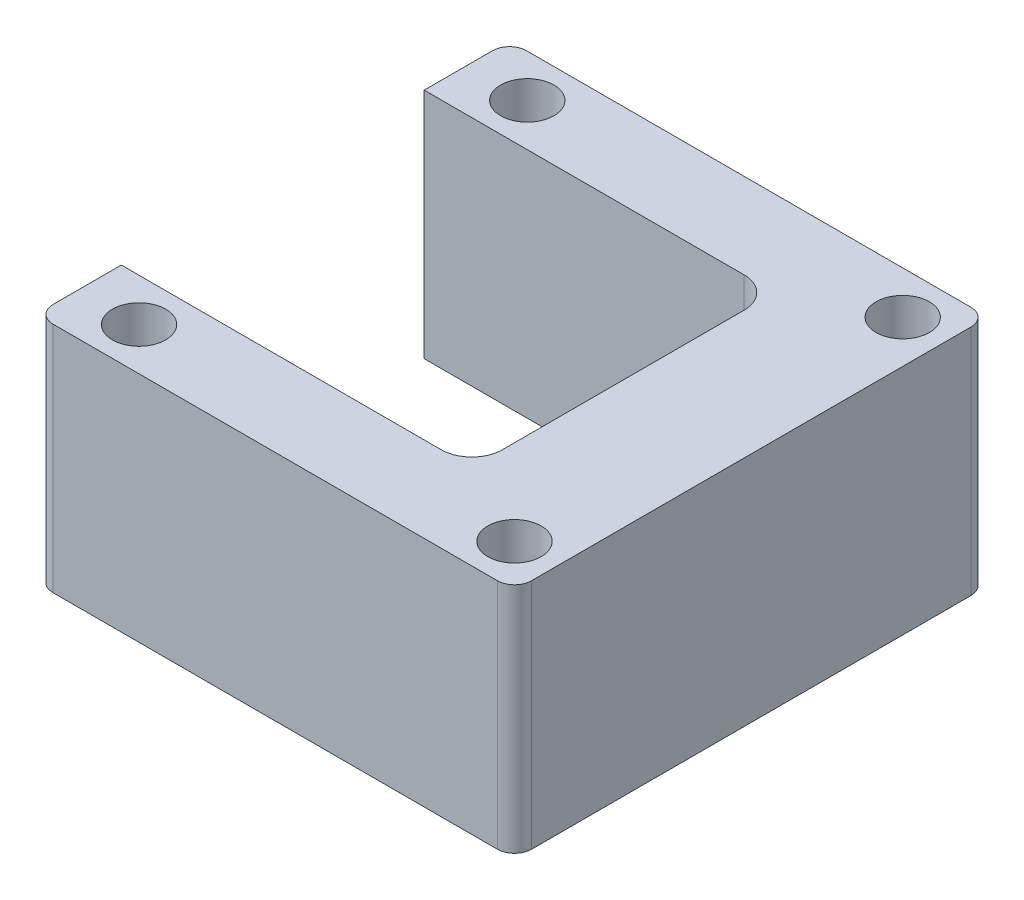
ISO-10303-21;
HEADER;
FILE_DESCRIPTION(('STEP AP214'),'2;1');
FILE_NAME('part.step','',(''),(''),'','','');
FILE_SCHEMA(('AUTOMOTIVE_DESIGN { 1 0 10303 214 1 1 1 1 }'));
ENDSEC;
DATA;
#1=APPLICATION_CONTEXT('core data for automotive mechanical design processes');
#2=APPLICATION_PROTOCOL_DEFINITION('international standard','automotive_design',2000,#1);
#3=PRODUCT_CONTEXT('',#1,'mechanical');
#4=PRODUCT('Part','Part','',(#3));
#5=PRODUCT_RELATED_PRODUCT_CATEGORY('part','',(#4));
#6=PRODUCT_DEFINITION_FORMATION('','',#4);
#7=PRODUCT_DEFINITION_CONTEXT('part definition',#1,'design');
#8=PRODUCT_DEFINITION('design','',#6,#7);
#9=PRODUCT_DEFINITION_SHAPE('','',#8);
#10=(LENGTH_UNIT() NAMED_UNIT(*) SI_UNIT(.MILLI.,.METRE.));
#11=(NAMED_UNIT(*) PLANE_ANGLE_UNIT() SI_UNIT($,.RADIAN.));
#12=(NAMED_UNIT(*) SI_UNIT($,.STERADIAN.) SOLID_ANGLE_UNIT());
#13=UNCERTAINTY_MEASURE_WITH_UNIT(LENGTH_MEASURE(1.E-05),#10,'distance_accuracy_value','');
#14=(GEOMETRIC_REPRESENTATION_CONTEXT(3) GLOBAL_UNCERTAINTY_ASSIGNED_CONTEXT((#13)) GLOBAL_UNIT_ASSIGNED_CONTEXT((#10,
#11,#12)) REPRESENTATION_CONTEXT('',''));
#15=CARTESIAN_POINT('',(0.,0.,0.));
#16=DIRECTION('',(0.,0.,1.));
#17=DIRECTION('',(1.,0.,0.));
#18=AXIS2_PLACEMENT_3D('',#15,#16,#17);
#19=CARTESIAN_POINT('',(0.,34.6202,-35.2425));
#20=DIRECTION('',(0.,0.,-1.));
#21=DIRECTION('',(-1.,0.,0.));
#22=AXIS2_PLACEMENT_3D('',#19,#20,#21);
#23=PLANE('',#22);
#24=DIRECTION('',(1.,0.,0.));
#25=VECTOR('',#24,1.);
#26=CARTESIAN_POINT('',(0.,0.,-35.2425));
#27=LINE('',#26,#25);
#28=CARTESIAN_POINT('',(-23.54707,0.,-35.2425));
#29=VERTEX_POINT('',#28);
#30=CARTESIAN_POINT('',(42.59707,0.,-35.2425));
#31=VERTEX_POINT('',#30);
#32=EDGE_CURVE('E182',#29,#31,#27,.T.);
#33=ORIENTED_EDGE('',*,*,#32,.F.);
#34=DIRECTION('',(0.,-1.,0.));
#35=VECTOR('',#34,1.);
#36=CARTESIAN_POINT('',(-23.54707,34.6202,-35.2425));
#37=LINE('',#36,#35);
#38=CARTESIAN_POINT('',(-23.54707,34.6202,-35.2425));
#39=VERTEX_POINT('',#38);
#40=EDGE_CURVE('E245',#29,#39,#37,.F.);
#41=ORIENTED_EDGE('',*,*,#40,.T.);
#42=DIRECTION('',(1.,0.,0.));
#43=VECTOR('',#42,1.);
#44=CARTESIAN_POINT('',(0.,34.6202,-35.2425));
#45=LINE('',#44,#43);
#46=CARTESIAN_POINT('',(42.59707,34.6202,-35.2425));
#47=VERTEX_POINT('',#46);
#48=EDGE_CURVE('E151',#39,#47,#45,.T.);
#49=ORIENTED_EDGE('',*,*,#48,.T.);
#50=DIRECTION('',(0.,-1.,0.));
#51=VECTOR('',#50,1.);
#52=CARTESIAN_POINT('',(42.59707,34.6202,-35.2425));
#53=LINE('',#52,#51);
#54=EDGE_CURVE('E242',#47,#31,#53,.T.);
#55=ORIENTED_EDGE('',*,*,#54,.T.);
#56=EDGE_LOOP('',(#33,#41,#49,#55));
#57=FACE_BOUND('',#56,.T.);
#58=ADVANCED_FACE('F38',(#57),#23,.T.);
#59=CARTESIAN_POINT('',(-26.08707,34.6202,0.));
#60=DIRECTION('',(1.,0.,0.));
#61=DIRECTION('',(0.,0.,-1.));
#62=AXIS2_PLACEMENT_3D('',#59,#60,#61);
#63=PLANE('',#62);
#64=DIRECTION('',(0.,0.,1.));
#65=VECTOR('',#64,1.);
#66=CARTESIAN_POINT('',(-26.08707,34.6202,0.));
#67=LINE('',#66,#65);
#68=CARTESIAN_POINT('',(-26.08707,34.6202,-32.7025));
#69=VERTEX_POINT('',#68);
#70=CARTESIAN_POINT('',(-26.08707,34.6202,-22.5425));
#71=VERTEX_POINT('',#70);
#72=EDGE_CURVE('E138',#69,#71,#67,.T.);
#73=ORIENTED_EDGE('',*,*,#72,.F.);
#74=DIRECTION('',(0.,-1.,0.));
#75=VECTOR('',#74,1.);
#76=CARTESIAN_POINT('',(-26.08707,0.,-32.7025));
#77=LINE('',#76,#75);
#78=CARTESIAN_POINT('',(-26.08707,0.,-32.7025));
#79=VERTEX_POINT('',#78);
#80=EDGE_CURVE('E240',#69,#79,#77,.T.);
#81=ORIENTED_EDGE('',*,*,#80,.T.);
#82=DIRECTION('',(0.,0.,1.));
#83=VECTOR('',#82,1.);
#84=CARTESIAN_POINT('',(-26.08707,0.,0.));
#85=LINE('',#84,#83);
#86=CARTESIAN_POINT('',(-26.08707,0.,-22.5425));
#87=VERTEX_POINT('',#86);
#88=EDGE_CURVE('E158',#79,#87,#85,.T.);
#89=ORIENTED_EDGE('',*,*,#88,.T.);
#90=DIRECTION('',(0.,-1.,0.));
#91=VECTOR('',#90,1.);
#92=CARTESIAN_POINT('',(-26.08707,34.6202,-22.5425));
#93=LINE('',#92,#91);
#94=EDGE_CURVE('E155',#71,#87,#93,.T.);
#95=ORIENTED_EDGE('',*,*,#94,.F.);
#96=EDGE_LOOP('',(#73,#81,#89,#95));
#97=FACE_BOUND('',#96,.T.);
#98=ADVANCED_FACE('F156',(#97),#63,.F.);
#99=CARTESIAN_POINT('',(0.,34.6202,-22.5425));
#100=DIRECTION('',(0.,0.,-1.));
#101=DIRECTION('',(-1.,0.,0.));
#102=AXIS2_PLACEMENT_3D('',#99,#100,#101);
#103=PLANE('',#102);
#104=DIRECTION('',(1.,0.,0.));
#105=VECTOR('',#104,1.);
#106=CARTESIAN_POINT('',(0.,0.,-22.5425));
#107=LINE('',#106,#105);
#108=CARTESIAN_POINT('',(21.53539,0.,-22.5425));
#109=VERTEX_POINT('',#108);
#110=EDGE_CURVE('E187',#87,#109,#107,.T.);
#111=ORIENTED_EDGE('',*,*,#110,.T.);
#112=DIRECTION('',(0.,-1.,0.));
#113=VECTOR('',#112,1.);
#114=CARTESIAN_POINT('',(21.53539,34.6202,-22.5425));
#115=LINE('',#114,#113);
#116=CARTESIAN_POINT('',(21.53539,34.6202,-22.5425));
#117=VERTEX_POINT('',#116);
#118=EDGE_CURVE('E167',#109,#117,#115,.F.);
#119=ORIENTED_EDGE('',*,*,#118,.T.);
#120=DIRECTION('',(1.,0.,0.));
#121=VECTOR('',#120,1.);
#122=CARTESIAN_POINT('',(0.,34.6202,-22.5425));
#123=LINE('',#122,#121);
#124=EDGE_CURVE('E143',#71,#117,#123,.T.);
#125=ORIENTED_EDGE('',*,*,#124,.F.);
#126=ORIENTED_EDGE('',*,*,#94,.T.);
#127=EDGE_LOOP('',(#111,#119,#125,#126));
#128=FACE_BOUND('',#127,.T.);
#129=ADVANCED_FACE('F165',(#128),#103,.F.);
#130=CARTESIAN_POINT('',(26.08707,34.6202,0.));
#131=DIRECTION('',(-1.,0.,0.));
#132=DIRECTION('',(0.,0.,1.));
#133=AXIS2_PLACEMENT_3D('',#130,#131,#132);
#134=PLANE('',#133);
#135=DIRECTION('',(0.,0.,-1.));
#136=VECTOR('',#135,1.);
#137=CARTESIAN_POINT('',(26.08707,0.,0.));
#138=LINE('',#137,#136);
#139=CARTESIAN_POINT('',(26.08707,0.,17.99082));
#140=VERTEX_POINT('',#139);
#141=CARTESIAN_POINT('',(26.08707,0.,-17.99082));
#142=VERTEX_POINT('',#141);
#143=EDGE_CURVE('E190',#140,#142,#138,.T.);
#144=ORIENTED_EDGE('',*,*,#143,.F.);
#145=DIRECTION('',(0.,-1.,0.));
#146=VECTOR('',#145,1.);
#147=CARTESIAN_POINT('',(26.08707,34.6202,17.99082));
#148=LINE('',#147,#146);
#149=CARTESIAN_POINT('',(26.08707,34.6202,17.99082));
#150=VERTEX_POINT('',#149);
#151=EDGE_CURVE('E208',#140,#150,#148,.F.);
#152=ORIENTED_EDGE('',*,*,#151,.T.);
#153=DIRECTION('',(0.,0.,-1.));
#154=VECTOR('',#153,1.);
#155=CARTESIAN_POINT('',(26.08707,34.6202,0.));
#156=LINE('',#155,#154);
#157=CARTESIAN_POINT('',(26.08707,34.6202,-17.99082));
#158=VERTEX_POINT('',#157);
#159=EDGE_CURVE('E168',#150,#158,#156,.T.);
#160=ORIENTED_EDGE('',*,*,#159,.T.);
#161=DIRECTION('',(0.,-1.,0.));
#162=VECTOR('',#161,1.);
#163=CARTESIAN_POINT('',(26.08707,34.6202,-17.99082));
#164=LINE('',#163,#162);
#165=EDGE_CURVE('E205',#158,#142,#164,.T.);
#166=ORIENTED_EDGE('',*,*,#165,.T.);
#167=EDGE_LOOP('',(#144,#152,#160,#166));
#168=FACE_BOUND('',#167,.T.);
#169=ADVANCED_FACE('F387',(#168),#134,.T.);
#170=CARTESIAN_POINT('',(0.,34.6202,22.5425));
#171=DIRECTION('',(0.,0.,-1.));
#172=DIRECTION('',(-1.,0.,0.));
#173=AXIS2_PLACEMENT_3D('',#170,#171,#172);
#174=PLANE('',#173);
#175=DIRECTION('',(1.,0.,0.));
#176=VECTOR('',#175,1.);
#177=CARTESIAN_POINT('',(0.,34.6202,22.5425));
#178=LINE('',#177,#176);
#179=CARTESIAN_POINT('',(-26.08707,34.6202,22.5425));
#180=VERTEX_POINT('',#179);
#181=CARTESIAN_POINT('',(21.53539,34.6202,22.5425));
#182=VERTEX_POINT('',#181);
#183=EDGE_CURVE('E171',#180,#182,#178,.T.);
#184=ORIENTED_EDGE('',*,*,#183,.T.);
#185=DIRECTION('',(0.,-1.,0.));
#186=VECTOR('',#185,1.);
#187=CARTESIAN_POINT('',(21.53539,0.,22.5425));
#188=LINE('',#187,#186);
#189=CARTESIAN_POINT('',(21.53539,0.,22.5425));
#190=VERTEX_POINT('',#189);
#191=EDGE_CURVE('E162',#182,#190,#188,.T.);
#192=ORIENTED_EDGE('',*,*,#191,.T.);
#193=DIRECTION('',(1.,0.,0.));
#194=VECTOR('',#193,1.);
#195=CARTESIAN_POINT('',(0.,0.,22.5425));
#196=LINE('',#195,#194);
#197=CARTESIAN_POINT('',(-26.08707,0.,22.5425));
#198=VERTEX_POINT('',#197);
#199=EDGE_CURVE('E193',#198,#190,#196,.T.);
#200=ORIENTED_EDGE('',*,*,#199,.F.);
#201=DIRECTION('',(0.,-1.,0.));
#202=VECTOR('',#201,1.);
#203=CARTESIAN_POINT('',(-26.08707,34.6202,22.5425));
#204=LINE('',#203,#202);
#205=EDGE_CURVE('E163',#180,#198,#204,.T.);
#206=ORIENTED_EDGE('',*,*,#205,.F.);
#207=EDGE_LOOP('',(#184,#192,#200,#206));
#208=FACE_BOUND('',#207,.T.);
#209=ADVANCED_FACE('F382',(#208),#174,.T.);
#210=CARTESIAN_POINT('',(-26.08707,0.,32.7025));
#211=VERTEX_POINT('',#210);
#212=EDGE_CURVE('E188',#198,#211,#85,.T.);
#213=ORIENTED_EDGE('',*,*,#212,.T.);
#214=DIRECTION('',(0.,-1.,0.));
#215=VECTOR('',#214,1.);
#216=CARTESIAN_POINT('',(-26.08707,34.6202,32.7025));
#217=LINE('',#216,#215);
#218=CARTESIAN_POINT('',(-26.08707,34.6202,32.7025));
#219=VERTEX_POINT('',#218);
#220=EDGE_CURVE('E232',#211,#219,#217,.F.);
#221=ORIENTED_EDGE('',*,*,#220,.T.);
#222=EDGE_CURVE('E153',#180,#219,#67,.T.);
#223=ORIENTED_EDGE('',*,*,#222,.F.);
#224=ORIENTED_EDGE('',*,*,#205,.T.);
#225=EDGE_LOOP('',(#213,#221,#223,#224));
#226=FACE_BOUND('',#225,.T.);
#227=ADVANCED_FACE('F344',(#226),#63,.F.);
#228=CARTESIAN_POINT('',(0.,34.6202,35.2425));
#229=DIRECTION('',(0.,0.,1.));
#230=DIRECTION('',(1.,0.,0.));
#231=AXIS2_PLACEMENT_3D('',#228,#229,#230);
#232=PLANE('',#231);
#233=DIRECTION('',(-1.,0.,0.));
#234=VECTOR('',#233,1.);
#235=CARTESIAN_POINT('',(0.,34.6202,35.2425));
#236=LINE('',#235,#234);
#237=CARTESIAN_POINT('',(42.59707,34.6202,35.2425));
#238=VERTEX_POINT('',#237);
#239=CARTESIAN_POINT('',(-23.54707,34.6202,35.2425));
#240=VERTEX_POINT('',#239);
#241=EDGE_CURVE('E177',#238,#240,#236,.T.);
#242=ORIENTED_EDGE('',*,*,#241,.T.);
#243=DIRECTION('',(0.,-1.,0.));
#244=VECTOR('',#243,1.);
#245=CARTESIAN_POINT('',(-23.54707,0.,35.2425));
#246=LINE('',#245,#244);
#247=CARTESIAN_POINT('',(-23.54707,0.,35.2425));
#248=VERTEX_POINT('',#247);
#249=EDGE_CURVE('E221',#240,#248,#246,.T.);
#250=ORIENTED_EDGE('',*,*,#249,.T.);
#251=DIRECTION('',(-1.,0.,0.));
#252=VECTOR('',#251,1.);
#253=CARTESIAN_POINT('',(0.,0.,35.2425));
#254=LINE('',#253,#252);
#255=CARTESIAN_POINT('',(42.59707,0.,35.2425));
#256=VERTEX_POINT('',#255);
#257=EDGE_CURVE('E196',#256,#248,#254,.T.);
#258=ORIENTED_EDGE('',*,*,#257,.F.);
#259=DIRECTION('',(0.,-1.,0.));
#260=VECTOR('',#259,1.);
#261=CARTESIAN_POINT('',(42.59707,34.6202,35.2425));
#262=LINE('',#261,#260);
#263=EDGE_CURVE('E219',#256,#238,#262,.F.);
#264=ORIENTED_EDGE('',*,*,#263,.T.);
#265=EDGE_LOOP('',(#242,#250,#258,#264));
#266=FACE_BOUND('',#265,.T.);
#267=ADVANCED_FACE('F371',(#266),#232,.T.);
#268=CARTESIAN_POINT('',(45.13707,34.6202,0.));
#269=DIRECTION('',(1.,0.,0.));
#270=DIRECTION('',(0.,0.,-1.));
#271=AXIS2_PLACEMENT_3D('',#268,#269,#270);
#272=PLANE('',#271);
#273=DIRECTION('',(0.,0.,1.));
#274=VECTOR('',#273,1.);
#275=CARTESIAN_POINT('',(45.13707,0.,0.));
#276=LINE('',#275,#274);
#277=CARTESIAN_POINT('',(45.13707,0.,-32.7025));
#278=VERTEX_POINT('',#277);
#279=CARTESIAN_POINT('',(45.13707,0.,32.7025));
#280=VERTEX_POINT('',#279);
#281=EDGE_CURVE('E199',#278,#280,#276,.T.);
#282=ORIENTED_EDGE('',*,*,#281,.F.);
#283=DIRECTION('',(0.,-1.,0.));
#284=VECTOR('',#283,1.);
#285=CARTESIAN_POINT('',(45.13707,34.6202,-32.7025));
#286=LINE('',#285,#284);
#287=CARTESIAN_POINT('',(45.13707,34.6202,-32.7025));
#288=VERTEX_POINT('',#287);
#289=EDGE_CURVE('E11',#278,#288,#286,.F.);
#290=ORIENTED_EDGE('',*,*,#289,.T.);
#291=DIRECTION('',(0.,0.,1.));
#292=VECTOR('',#291,1.);
#293=CARTESIAN_POINT('',(45.13707,34.6202,0.));
#294=LINE('',#293,#292);
#295=CARTESIAN_POINT('',(45.13707,34.6202,32.7025));
#296=VERTEX_POINT('',#295);
#297=EDGE_CURVE('E180',#288,#296,#294,.T.);
#298=ORIENTED_EDGE('',*,*,#297,.T.);
#299=DIRECTION('',(0.,-1.,0.));
#300=VECTOR('',#299,1.);
#301=CARTESIAN_POINT('',(45.13707,34.6202,32.7025));
#302=LINE('',#301,#300);
#303=EDGE_CURVE('E46',#296,#280,#302,.T.);
#304=ORIENTED_EDGE('',*,*,#303,.T.);
#305=EDGE_LOOP('',(#282,#290,#298,#304));
#306=FACE_BOUND('',#305,.T.);
#307=ADVANCED_FACE('F248',(#306),#272,.T.);
#308=CARTESIAN_POINT('',(0.,34.6202,0.));
#309=DIRECTION('',(0.,1.,0.));
#310=DIRECTION('',(0.,0.,1.));
#311=AXIS2_PLACEMENT_3D('',#308,#309,#310);
#312=PLANE('',#311);
#313=CARTESIAN_POINT('',(38.78707,34.6202,-28.8925));
#314=DIRECTION('',(0.,1.,0.));
#315=DIRECTION('',(0.,0.,1.));
#316=AXIS2_PLACEMENT_3D('',#313,#314,#315);
#317=CIRCLE('',#316,3.96874999999999);
#318=CARTESIAN_POINT('',(38.78707,34.6202,-24.92375));
#319=VERTEX_POINT('',#318);
#320=EDGE_CURVE('E306',#319,#319,#317,.T.);
#321=ORIENTED_EDGE('',*,*,#320,.F.);
#322=EDGE_LOOP('',(#321));
#323=FACE_BOUND('',#322,.T.);
#324=CARTESIAN_POINT('',(38.78707,34.6202,28.8925));
#325=DIRECTION('',(0.,1.,0.));
#326=DIRECTION('',(0.,0.,1.));
#327=AXIS2_PLACEMENT_3D('',#324,#325,#326);
#328=CIRCLE('',#327,3.96874999999999);
#329=CARTESIAN_POINT('',(38.78707,34.6202,32.86125));
#330=VERTEX_POINT('',#329);
#331=EDGE_CURVE('E294',#330,#330,#328,.T.);
#332=ORIENTED_EDGE('',*,*,#331,.F.);
#333=EDGE_LOOP('',(#332));
#334=FACE_BOUND('',#333,.T.);
#335=CARTESIAN_POINT('',(-17.09293,34.6202,-28.8925));
#336=DIRECTION('',(0.,1.,0.));
#337=DIRECTION('',(0.,0.,1.));
#338=AXIS2_PLACEMENT_3D('',#335,#336,#337);
#339=CIRCLE('',#338,3.96875);
#340=CARTESIAN_POINT('',(-17.09293,34.6202,-24.92375));
#341=VERTEX_POINT('',#340);
#342=EDGE_CURVE('E282',#341,#341,#339,.T.);
#343=ORIENTED_EDGE('',*,*,#342,.F.);
#344=EDGE_LOOP('',(#343));
#345=FACE_BOUND('',#344,.T.);
#346=CARTESIAN_POINT('',(-17.09293,34.6202,28.8925));
#347=DIRECTION('',(0.,1.,0.));
#348=DIRECTION('',(0.,0.,1.));
#349=AXIS2_PLACEMENT_3D('',#346,#347,#348);
#350=CIRCLE('',#349,3.96875);
#351=CARTESIAN_POINT('',(-17.09293,34.6202,32.86125));
#352=VERTEX_POINT('',#351);
#353=EDGE_CURVE('E270',#352,#352,#350,.T.);
#354=ORIENTED_EDGE('',*,*,#353,.F.);
#355=EDGE_LOOP('',(#354));
#356=FACE_BOUND('',#355,.T.);
#357=ORIENTED_EDGE('',*,*,#222,.T.);
#358=CARTESIAN_POINT('',(-23.54707,34.6202,32.7025));
#359=DIRECTION('',(0.,1.,0.));
#360=DIRECTION('',(0.,0.,1.));
#361=AXIS2_PLACEMENT_3D('',#358,#359,#360);
#362=CIRCLE('',#361,2.54);
#363=EDGE_CURVE('E238',#219,#240,#362,.T.);
#364=ORIENTED_EDGE('',*,*,#363,.T.);
#365=ORIENTED_EDGE('',*,*,#241,.F.);
#366=CARTESIAN_POINT('',(42.59707,34.6202,32.7025));
#367=DIRECTION('',(0.,1.,0.));
#368=DIRECTION('',(0.,0.,1.));
#369=AXIS2_PLACEMENT_3D('',#366,#367,#368);
#370=CIRCLE('',#369,2.54);
#371=EDGE_CURVE('E53',#238,#296,#370,.T.);
#372=ORIENTED_EDGE('',*,*,#371,.T.);
#373=ORIENTED_EDGE('',*,*,#297,.F.);
#374=CARTESIAN_POINT('',(42.59707,34.6202,-32.7025));
#375=DIRECTION('',(0.,1.,0.));
#376=DIRECTION('',(0.,0.,1.));
#377=AXIS2_PLACEMENT_3D('',#374,#375,#376);
#378=CIRCLE('',#377,2.54);
#379=EDGE_CURVE('E235',#288,#47,#378,.T.);
#380=ORIENTED_EDGE('',*,*,#379,.T.);
#381=ORIENTED_EDGE('',*,*,#48,.F.);
#382=CARTESIAN_POINT('',(-23.54707,34.6202,-32.7025));
#383=DIRECTION('',(0.,1.,0.));
#384=DIRECTION('',(0.,0.,1.));
#385=AXIS2_PLACEMENT_3D('',#382,#383,#384);
#386=CIRCLE('',#385,2.54);
#387=EDGE_CURVE('E147',#39,#69,#386,.T.);
#388=ORIENTED_EDGE('',*,*,#387,.T.);
#389=ORIENTED_EDGE('',*,*,#72,.T.);
#390=ORIENTED_EDGE('',*,*,#124,.T.);
#391=CARTESIAN_POINT('',(21.53539,34.6202,-17.99082));
#392=DIRECTION('',(0.,1.,0.));
#393=DIRECTION('',(0.,0.,1.));
#394=AXIS2_PLACEMENT_3D('',#391,#392,#393);
#395=CIRCLE('',#394,4.55168);
#396=EDGE_CURVE('E217',#117,#158,#395,.F.);
#397=ORIENTED_EDGE('',*,*,#396,.T.);
#398=ORIENTED_EDGE('',*,*,#159,.F.);
#399=CARTESIAN_POINT('',(21.53539,34.6202,17.99082));
#400=DIRECTION('',(0.,1.,0.));
#401=DIRECTION('',(0.,0.,1.));
#402=AXIS2_PLACEMENT_3D('',#399,#400,#401);
#403=CIRCLE('',#402,4.55168);
#404=EDGE_CURVE('E213',#150,#182,#403,.F.);
#405=ORIENTED_EDGE('',*,*,#404,.T.);
#406=ORIENTED_EDGE('',*,*,#183,.F.);
#407=EDGE_LOOP('',(#357,#364,#365,#372,#373,#380,#381,#388,#389,#390,#397,#398,#405,#406));
#408=FACE_BOUND('',#407,.T.);
#409=ADVANCED_FACE('F141',(#323,#334,#345,#356,#408),#312,.T.);
#410=CARTESIAN_POINT('',(0.,0.,0.));
#411=DIRECTION('',(0.,1.,0.));
#412=DIRECTION('',(0.,0.,1.));
#413=AXIS2_PLACEMENT_3D('',#410,#411,#412);
#414=PLANE('',#413);
#415=CARTESIAN_POINT('',(38.78707,0.,-28.8925));
#416=DIRECTION('',(0.,1.,0.));
#417=DIRECTION('',(0.,0.,1.));
#418=AXIS2_PLACEMENT_3D('',#415,#416,#417);
#419=CIRCLE('',#418,2.24789999999999);
#420=CARTESIAN_POINT('',(38.78707,0.,-26.6446));
#421=VERTEX_POINT('',#420);
#422=EDGE_CURVE('E297',#421,#421,#419,.T.);
#423=ORIENTED_EDGE('',*,*,#422,.T.);
#424=EDGE_LOOP('',(#423));
#425=FACE_BOUND('',#424,.T.);
#426=CARTESIAN_POINT('',(38.78707,0.,28.8925));
#427=DIRECTION('',(0.,1.,0.));
#428=DIRECTION('',(0.,0.,1.));
#429=AXIS2_PLACEMENT_3D('',#426,#427,#428);
#430=CIRCLE('',#429,2.24789999999999);
#431=CARTESIAN_POINT('',(38.78707,0.,31.1404));
#432=VERTEX_POINT('',#431);
#433=EDGE_CURVE('E285',#432,#432,#430,.T.);
#434=ORIENTED_EDGE('',*,*,#433,.T.);
#435=EDGE_LOOP('',(#434));
#436=FACE_BOUND('',#435,.T.);
#437=CARTESIAN_POINT('',(-17.09293,0.,-28.8925));
#438=DIRECTION('',(0.,1.,0.));
#439=DIRECTION('',(0.,0.,1.));
#440=AXIS2_PLACEMENT_3D('',#437,#438,#439);
#441=CIRCLE('',#440,2.24789999999999);
#442=CARTESIAN_POINT('',(-17.09293,0.,-26.6446));
#443=VERTEX_POINT('',#442);
#444=EDGE_CURVE('E273',#443,#443,#441,.T.);
#445=ORIENTED_EDGE('',*,*,#444,.T.);
#446=EDGE_LOOP('',(#445));
#447=FACE_BOUND('',#446,.T.);
#448=CARTESIAN_POINT('',(-17.09293,0.,28.8925));
#449=DIRECTION('',(0.,1.,0.));
#450=DIRECTION('',(0.,0.,1.));
#451=AXIS2_PLACEMENT_3D('',#448,#449,#450);
#452=CIRCLE('',#451,2.24789999999999);
#453=CARTESIAN_POINT('',(-17.09293,0.,31.1404));
#454=VERTEX_POINT('',#453);
#455=EDGE_CURVE('E185',#454,#454,#452,.T.);
#456=ORIENTED_EDGE('',*,*,#455,.T.);
#457=EDGE_LOOP('',(#456));
#458=FACE_BOUND('',#457,.T.);
#459=ORIENTED_EDGE('',*,*,#257,.T.);
#460=CARTESIAN_POINT('',(-23.54707,0.,32.7025));
#461=DIRECTION('',(0.,1.,0.));
#462=DIRECTION('',(0.,0.,1.));
#463=AXIS2_PLACEMENT_3D('',#460,#461,#462);
#464=CIRCLE('',#463,2.54);
#465=EDGE_CURVE('E230',#248,#211,#464,.F.);
#466=ORIENTED_EDGE('',*,*,#465,.T.);
#467=ORIENTED_EDGE('',*,*,#212,.F.);
#468=ORIENTED_EDGE('',*,*,#199,.T.);
#469=CARTESIAN_POINT('',(21.53539,0.,17.99082));
#470=DIRECTION('',(0.,1.,0.));
#471=DIRECTION('',(0.,0.,1.));
#472=AXIS2_PLACEMENT_3D('',#469,#470,#471);
#473=CIRCLE('',#472,4.55168);
#474=EDGE_CURVE('E211',#190,#140,#473,.T.);
#475=ORIENTED_EDGE('',*,*,#474,.T.);
#476=ORIENTED_EDGE('',*,*,#143,.T.);
#477=CARTESIAN_POINT('',(21.53539,0.,-17.99082));
#478=DIRECTION('',(0.,1.,0.));
#479=DIRECTION('',(0.,0.,1.));
#480=AXIS2_PLACEMENT_3D('',#477,#478,#479);
#481=CIRCLE('',#480,4.55168);
#482=EDGE_CURVE('E215',#142,#109,#481,.T.);
#483=ORIENTED_EDGE('',*,*,#482,.T.);
#484=ORIENTED_EDGE('',*,*,#110,.F.);
#485=ORIENTED_EDGE('',*,*,#88,.F.);
#486=CARTESIAN_POINT('',(-23.54707,0.,-32.7025));
#487=DIRECTION('',(0.,1.,0.));
#488=DIRECTION('',(0.,0.,1.));
#489=AXIS2_PLACEMENT_3D('',#486,#487,#488);
#490=CIRCLE('',#489,2.54);
#491=EDGE_CURVE('E228',#79,#29,#490,.F.);
#492=ORIENTED_EDGE('',*,*,#491,.T.);
#493=ORIENTED_EDGE('',*,*,#32,.T.);
#494=CARTESIAN_POINT('',(42.59707,0.,-32.7025));
#495=DIRECTION('',(0.,1.,0.));
#496=DIRECTION('',(0.,0.,1.));
#497=AXIS2_PLACEMENT_3D('',#494,#495,#496);
#498=CIRCLE('',#497,2.54);
#499=EDGE_CURVE('E226',#31,#278,#498,.F.);
#500=ORIENTED_EDGE('',*,*,#499,.T.);
#501=ORIENTED_EDGE('',*,*,#281,.T.);
#502=CARTESIAN_POINT('',(42.59707,0.,32.7025));
#503=DIRECTION('',(0.,1.,0.));
#504=DIRECTION('',(0.,0.,1.));
#505=AXIS2_PLACEMENT_3D('',#502,#503,#504);
#506=CIRCLE('',#505,2.54);
#507=EDGE_CURVE('E224',#280,#256,#506,.F.);
#508=ORIENTED_EDGE('',*,*,#507,.T.);
#509=EDGE_LOOP('',(#459,#466,#467,#468,#475,#476,#483,#484,#485,#492,#493,#500,#501,#508));
#510=FACE_BOUND('',#509,.T.);
#511=ADVANCED_FACE('F251',(#425,#436,#447,#458,#510),#414,.F.);
#512=CARTESIAN_POINT('',(-17.09293,34.6202,28.8925));
#513=DIRECTION('',(0.,1.,0.));
#514=DIRECTION('',(0.,0.,1.));
#515=AXIS2_PLACEMENT_3D('',#512,#513,#514);
#516=CYLINDRICAL_SURFACE('',#515,2.24789999999999);
#517=ORIENTED_EDGE('',*,*,#455,.F.);
#518=EDGE_LOOP('',(#517));
#519=FACE_BOUND('',#518,.T.);
#520=CARTESIAN_POINT('',(-17.09293,11.4046,28.8925));
#521=DIRECTION('',(0.,1.,0.));
#522=DIRECTION('',(0.,0.,1.));
#523=AXIS2_PLACEMENT_3D('',#520,#521,#522);
#524=CIRCLE('',#523,2.24789999999999);
#525=CARTESIAN_POINT('',(-17.09293,11.4046,31.1404));
#526=VERTEX_POINT('',#525);
#527=EDGE_CURVE('E264',#526,#526,#524,.T.);
#528=ORIENTED_EDGE('',*,*,#527,.T.);
#529=EDGE_LOOP('',(#528));
#530=FACE_BOUND('',#529,.T.);
#531=ADVANCED_FACE('F334',(#519,#530),#516,.F.);
#532=CARTESIAN_POINT('',(-14.84503,11.4046,28.8925));
#533=DIRECTION('',(0.,-1.,0.));
#534=DIRECTION('',(0.,0.,-1.));
#535=AXIS2_PLACEMENT_3D('',#532,#533,#534);
#536=PLANE('',#535);
#537=ORIENTED_EDGE('',*,*,#527,.F.);
#538=EDGE_LOOP('',(#537));
#539=FACE_BOUND('',#538,.T.);
#540=CARTESIAN_POINT('',(-17.09293,11.4046,28.8925));
#541=DIRECTION('',(0.,1.,0.));
#542=DIRECTION('',(0.,0.,1.));
#543=AXIS2_PLACEMENT_3D('',#540,#541,#542);
#544=CIRCLE('',#543,3.96875);
#545=CARTESIAN_POINT('',(-17.09293,11.4046,32.86125));
#546=VERTEX_POINT('',#545);
#547=EDGE_CURVE('E267',#546,#546,#544,.T.);
#548=ORIENTED_EDGE('',*,*,#547,.T.);
#549=EDGE_LOOP('',(#548));
#550=FACE_BOUND('',#549,.T.);
#551=ADVANCED_FACE('F324',(#539,#550),#536,.F.);
#552=CARTESIAN_POINT('',(-17.09293,34.6202,28.8925));
#553=DIRECTION('',(0.,1.,0.));
#554=DIRECTION('',(0.,0.,1.));
#555=AXIS2_PLACEMENT_3D('',#552,#553,#554);
#556=CYLINDRICAL_SURFACE('',#555,3.96875);
#557=ORIENTED_EDGE('',*,*,#547,.F.);
#558=EDGE_LOOP('',(#557));
#559=FACE_BOUND('',#558,.T.);
#560=ORIENTED_EDGE('',*,*,#353,.T.);
#561=EDGE_LOOP('',(#560));
#562=FACE_BOUND('',#561,.T.);
#563=ADVANCED_FACE('F321',(#559,#562),#556,.F.);
#564=CARTESIAN_POINT('',(-17.09293,34.6202,-28.8925));
#565=DIRECTION('',(0.,1.,0.));
#566=DIRECTION('',(0.,0.,1.));
#567=AXIS2_PLACEMENT_3D('',#564,#565,#566);
#568=CYLINDRICAL_SURFACE('',#567,2.24789999999999);
#569=ORIENTED_EDGE('',*,*,#444,.F.);
#570=EDGE_LOOP('',(#569));
#571=FACE_BOUND('',#570,.T.);
#572=CARTESIAN_POINT('',(-17.09293,11.4046,-28.8925));
#573=DIRECTION('',(0.,1.,0.));
#574=DIRECTION('',(0.,0.,1.));
#575=AXIS2_PLACEMENT_3D('',#572,#573,#574);
#576=CIRCLE('',#575,2.24789999999999);
#577=CARTESIAN_POINT('',(-17.09293,11.4046,-26.6446));
#578=VERTEX_POINT('',#577);
#579=EDGE_CURVE('E276',#578,#578,#576,.T.);
#580=ORIENTED_EDGE('',*,*,#579,.T.);
#581=EDGE_LOOP('',(#580));
#582=FACE_BOUND('',#581,.T.);
#583=ADVANCED_FACE('F323',(#571,#582),#568,.F.);
#584=CARTESIAN_POINT('',(-14.84503,11.4046,-28.8925));
#585=DIRECTION('',(0.,-1.,0.));
#586=DIRECTION('',(0.,0.,-1.));
#587=AXIS2_PLACEMENT_3D('',#584,#585,#586);
#588=PLANE('',#587);
#589=ORIENTED_EDGE('',*,*,#579,.F.);
#590=EDGE_LOOP('',(#589));
#591=FACE_BOUND('',#590,.T.);
#592=CARTESIAN_POINT('',(-17.09293,11.4046,-28.8925));
#593=DIRECTION('',(0.,1.,0.));
#594=DIRECTION('',(0.,0.,1.));
#595=AXIS2_PLACEMENT_3D('',#592,#593,#594);
#596=CIRCLE('',#595,3.96875);
#597=CARTESIAN_POINT('',(-17.09293,11.4046,-24.92375));
#598=VERTEX_POINT('',#597);
#599=EDGE_CURVE('E279',#598,#598,#596,.T.);
#600=ORIENTED_EDGE('',*,*,#599,.T.);
#601=EDGE_LOOP('',(#600));
#602=FACE_BOUND('',#601,.T.);
#603=ADVANCED_FACE('F331',(#591,#602),#588,.F.);
#604=CARTESIAN_POINT('',(-17.09293,34.6202,-28.8925));
#605=DIRECTION('',(0.,1.,0.));
#606=DIRECTION('',(0.,0.,1.));
#607=AXIS2_PLACEMENT_3D('',#604,#605,#606);
#608=CYLINDRICAL_SURFACE('',#607,3.96875);
#609=ORIENTED_EDGE('',*,*,#599,.F.);
#610=EDGE_LOOP('',(#609));
#611=FACE_BOUND('',#610,.T.);
#612=ORIENTED_EDGE('',*,*,#342,.T.);
#613=EDGE_LOOP('',(#612));
#614=FACE_BOUND('',#613,.T.);
#615=ADVANCED_FACE('F440',(#611,#614),#608,.F.);
#616=CARTESIAN_POINT('',(38.78707,34.6202,28.8925));
#617=DIRECTION('',(0.,1.,0.));
#618=DIRECTION('',(0.,0.,1.));
#619=AXIS2_PLACEMENT_3D('',#616,#617,#618);
#620=CYLINDRICAL_SURFACE('',#619,2.24789999999999);
#621=ORIENTED_EDGE('',*,*,#433,.F.);
#622=EDGE_LOOP('',(#621));
#623=FACE_BOUND('',#622,.T.);
#624=CARTESIAN_POINT('',(38.78707,11.4046,28.8925));
#625=DIRECTION('',(0.,1.,0.));
#626=DIRECTION('',(0.,0.,1.));
#627=AXIS2_PLACEMENT_3D('',#624,#625,#626);
#628=CIRCLE('',#627,2.2479);
#629=CARTESIAN_POINT('',(38.78707,11.4046,31.1404));
#630=VERTEX_POINT('',#629);
#631=EDGE_CURVE('E288',#630,#630,#628,.T.);
#632=ORIENTED_EDGE('',*,*,#631,.T.);
#633=EDGE_LOOP('',(#632));
#634=FACE_BOUND('',#633,.T.);
#635=ADVANCED_FACE('F450',(#623,#634),#620,.F.);
#636=CARTESIAN_POINT('',(41.03497,11.4046,28.8925));
#637=DIRECTION('',(0.,-1.,0.));
#638=DIRECTION('',(0.,0.,-1.));
#639=AXIS2_PLACEMENT_3D('',#636,#637,#638);
#640=PLANE('',#639);
#641=ORIENTED_EDGE('',*,*,#631,.F.);
#642=EDGE_LOOP('',(#641));
#643=FACE_BOUND('',#642,.T.);
#644=CARTESIAN_POINT('',(38.78707,11.4046,28.8925));
#645=DIRECTION('',(0.,1.,0.));
#646=DIRECTION('',(0.,0.,1.));
#647=AXIS2_PLACEMENT_3D('',#644,#645,#646);
#648=CIRCLE('',#647,3.96874999999999);
#649=CARTESIAN_POINT('',(38.78707,11.4046,32.86125));
#650=VERTEX_POINT('',#649);
#651=EDGE_CURVE('E291',#650,#650,#648,.T.);
#652=ORIENTED_EDGE('',*,*,#651,.T.);
#653=EDGE_LOOP('',(#652));
#654=FACE_BOUND('',#653,.T.);
#655=ADVANCED_FACE('F460',(#643,#654),#640,.F.);
#656=CARTESIAN_POINT('',(38.78707,34.6202,28.8925));
#657=DIRECTION('',(0.,1.,0.));
#658=DIRECTION('',(0.,0.,1.));
#659=AXIS2_PLACEMENT_3D('',#656,#657,#658);
#660=CYLINDRICAL_SURFACE('',#659,3.96874999999999);
#661=ORIENTED_EDGE('',*,*,#651,.F.);
#662=EDGE_LOOP('',(#661));
#663=FACE_BOUND('',#662,.T.);
#664=ORIENTED_EDGE('',*,*,#331,.T.);
#665=EDGE_LOOP('',(#664));
#666=FACE_BOUND('',#665,.T.);
#667=ADVANCED_FACE('F470',(#663,#666),#660,.F.);
#668=CARTESIAN_POINT('',(38.78707,34.6202,-28.8925));
#669=DIRECTION('',(0.,1.,0.));
#670=DIRECTION('',(0.,0.,1.));
#671=AXIS2_PLACEMENT_3D('',#668,#669,#670);
#672=CYLINDRICAL_SURFACE('',#671,2.24789999999999);
#673=ORIENTED_EDGE('',*,*,#422,.F.);
#674=EDGE_LOOP('',(#673));
#675=FACE_BOUND('',#674,.T.);
#676=CARTESIAN_POINT('',(38.78707,11.4046,-28.8925));
#677=DIRECTION('',(0.,1.,0.));
#678=DIRECTION('',(0.,0.,1.));
#679=AXIS2_PLACEMENT_3D('',#676,#677,#678);
#680=CIRCLE('',#679,2.2479);
#681=CARTESIAN_POINT('',(38.78707,11.4046,-26.6446));
#682=VERTEX_POINT('',#681);
#683=EDGE_CURVE('E300',#682,#682,#680,.T.);
#684=ORIENTED_EDGE('',*,*,#683,.T.);
#685=EDGE_LOOP('',(#684));
#686=FACE_BOUND('',#685,.T.);
#687=ADVANCED_FACE('F480',(#675,#686),#672,.F.);
#688=CARTESIAN_POINT('',(41.03497,11.4046,-28.8925));
#689=DIRECTION('',(0.,-1.,0.));
#690=DIRECTION('',(0.,0.,-1.));
#691=AXIS2_PLACEMENT_3D('',#688,#689,#690);
#692=PLANE('',#691);
#693=ORIENTED_EDGE('',*,*,#683,.F.);
#694=EDGE_LOOP('',(#693));
#695=FACE_BOUND('',#694,.T.);
#696=CARTESIAN_POINT('',(38.78707,11.4046,-28.8925));
#697=DIRECTION('',(0.,1.,0.));
#698=DIRECTION('',(0.,0.,1.));
#699=AXIS2_PLACEMENT_3D('',#696,#697,#698);
#700=CIRCLE('',#699,3.96874999999999);
#701=CARTESIAN_POINT('',(38.78707,11.4046,-24.92375));
#702=VERTEX_POINT('',#701);
#703=EDGE_CURVE('E303',#702,#702,#700,.T.);
#704=ORIENTED_EDGE('',*,*,#703,.T.);
#705=EDGE_LOOP('',(#704));
#706=FACE_BOUND('',#705,.T.);
#707=ADVANCED_FACE('F490',(#695,#706),#692,.F.);
#708=CARTESIAN_POINT('',(38.78707,34.6202,-28.8925));
#709=DIRECTION('',(0.,1.,0.));
#710=DIRECTION('',(0.,0.,1.));
#711=AXIS2_PLACEMENT_3D('',#708,#709,#710);
#712=CYLINDRICAL_SURFACE('',#711,3.96874999999999);
#713=ORIENTED_EDGE('',*,*,#703,.F.);
#714=EDGE_LOOP('',(#713));
#715=FACE_BOUND('',#714,.T.);
#716=ORIENTED_EDGE('',*,*,#320,.T.);
#717=EDGE_LOOP('',(#716));
#718=FACE_BOUND('',#717,.T.);
#719=ADVANCED_FACE('F310',(#715,#718),#712,.F.);
#720=CARTESIAN_POINT('',(21.53539,34.6202,17.99082));
#721=DIRECTION('',(0.,1.,0.));
#722=DIRECTION('',(0.,0.,1.));
#723=AXIS2_PLACEMENT_3D('',#720,#721,#722);
#724=CYLINDRICAL_SURFACE('',#723,4.55168);
#725=ORIENTED_EDGE('',*,*,#404,.F.);
#726=ORIENTED_EDGE('',*,*,#151,.F.);
#727=ORIENTED_EDGE('',*,*,#474,.F.);
#728=ORIENTED_EDGE('',*,*,#191,.F.);
#729=EDGE_LOOP('',(#725,#726,#727,#728));
#730=FACE_BOUND('',#729,.T.);
#731=ADVANCED_FACE('F348',(#730),#724,.F.);
#732=CARTESIAN_POINT('',(21.53539,34.6202,-17.99082));
#733=DIRECTION('',(0.,-1.,0.));
#734=DIRECTION('',(0.,0.,-1.));
#735=AXIS2_PLACEMENT_3D('',#732,#733,#734);
#736=CYLINDRICAL_SURFACE('',#735,4.55168);
#737=ORIENTED_EDGE('',*,*,#396,.F.);
#738=ORIENTED_EDGE('',*,*,#118,.F.);
#739=ORIENTED_EDGE('',*,*,#482,.F.);
#740=ORIENTED_EDGE('',*,*,#165,.F.);
#741=EDGE_LOOP('',(#737,#738,#739,#740));
#742=FACE_BOUND('',#741,.T.);
#743=ADVANCED_FACE('F351',(#742),#736,.F.);
#744=CARTESIAN_POINT('',(-23.54707,34.6202,32.7025));
#745=DIRECTION('',(0.,1.,0.));
#746=DIRECTION('',(0.,0.,1.));
#747=AXIS2_PLACEMENT_3D('',#744,#745,#746);
#748=CYLINDRICAL_SURFACE('',#747,2.54);
#749=ORIENTED_EDGE('',*,*,#363,.F.);
#750=ORIENTED_EDGE('',*,*,#220,.F.);
#751=ORIENTED_EDGE('',*,*,#465,.F.);
#752=ORIENTED_EDGE('',*,*,#249,.F.);
#753=EDGE_LOOP('',(#749,#750,#751,#752));
#754=FACE_BOUND('',#753,.T.);
#755=ADVANCED_FACE('F355',(#754),#748,.T.);
#756=CARTESIAN_POINT('',(-23.54707,34.6202,-32.7025));
#757=DIRECTION('',(0.,1.,0.));
#758=DIRECTION('',(0.,0.,1.));
#759=AXIS2_PLACEMENT_3D('',#756,#757,#758);
#760=CYLINDRICAL_SURFACE('',#759,2.54);
#761=ORIENTED_EDGE('',*,*,#387,.F.);
#762=ORIENTED_EDGE('',*,*,#40,.F.);
#763=ORIENTED_EDGE('',*,*,#491,.F.);
#764=ORIENTED_EDGE('',*,*,#80,.F.);
#765=EDGE_LOOP('',(#761,#762,#763,#764));
#766=FACE_BOUND('',#765,.T.);
#767=ADVANCED_FACE('F359',(#766),#760,.T.);
#768=CARTESIAN_POINT('',(42.59707,34.6202,-32.7025));
#769=DIRECTION('',(0.,-1.,0.));
#770=DIRECTION('',(0.,0.,-1.));
#771=AXIS2_PLACEMENT_3D('',#768,#769,#770);
#772=CYLINDRICAL_SURFACE('',#771,2.54);
#773=ORIENTED_EDGE('',*,*,#379,.F.);
#774=ORIENTED_EDGE('',*,*,#289,.F.);
#775=ORIENTED_EDGE('',*,*,#499,.F.);
#776=ORIENTED_EDGE('',*,*,#54,.F.);
#777=EDGE_LOOP('',(#773,#774,#775,#776));
#778=FACE_BOUND('',#777,.T.);
#779=ADVANCED_FACE('F257',(#778),#772,.T.);
#780=CARTESIAN_POINT('',(42.59707,34.6202,32.7025));
#781=DIRECTION('',(0.,-1.,0.));
#782=DIRECTION('',(0.,0.,-1.));
#783=AXIS2_PLACEMENT_3D('',#780,#781,#782);
#784=CYLINDRICAL_SURFACE('',#783,2.54);
#785=ORIENTED_EDGE('',*,*,#371,.F.);
#786=ORIENTED_EDGE('',*,*,#263,.F.);
#787=ORIENTED_EDGE('',*,*,#507,.F.);
#788=ORIENTED_EDGE('',*,*,#303,.F.);
#789=EDGE_LOOP('',(#785,#786,#787,#788));
#790=FACE_BOUND('',#789,.T.);
#791=ADVANCED_FACE('F40',(#790),#784,.T.);
#792=CLOSED_SHELL('',(#58,#98,#129,#169,#209,#227,#267,#307,#409,#511,#531,#551,#563,#583,#603,
#615,#635,#655,#667,#687,#707,#719,#731,#743,#755,#767,#779,#791));
#793=MANIFOLD_SOLID_BREP('B2',#792);
#794=ADVANCED_BREP_SHAPE_REPRESENTATION('',(#18,#793),#14);
#795=SHAPE_DEFINITION_REPRESENTATION(#9,#794);
ENDSEC;
END-ISO-10303-21;
